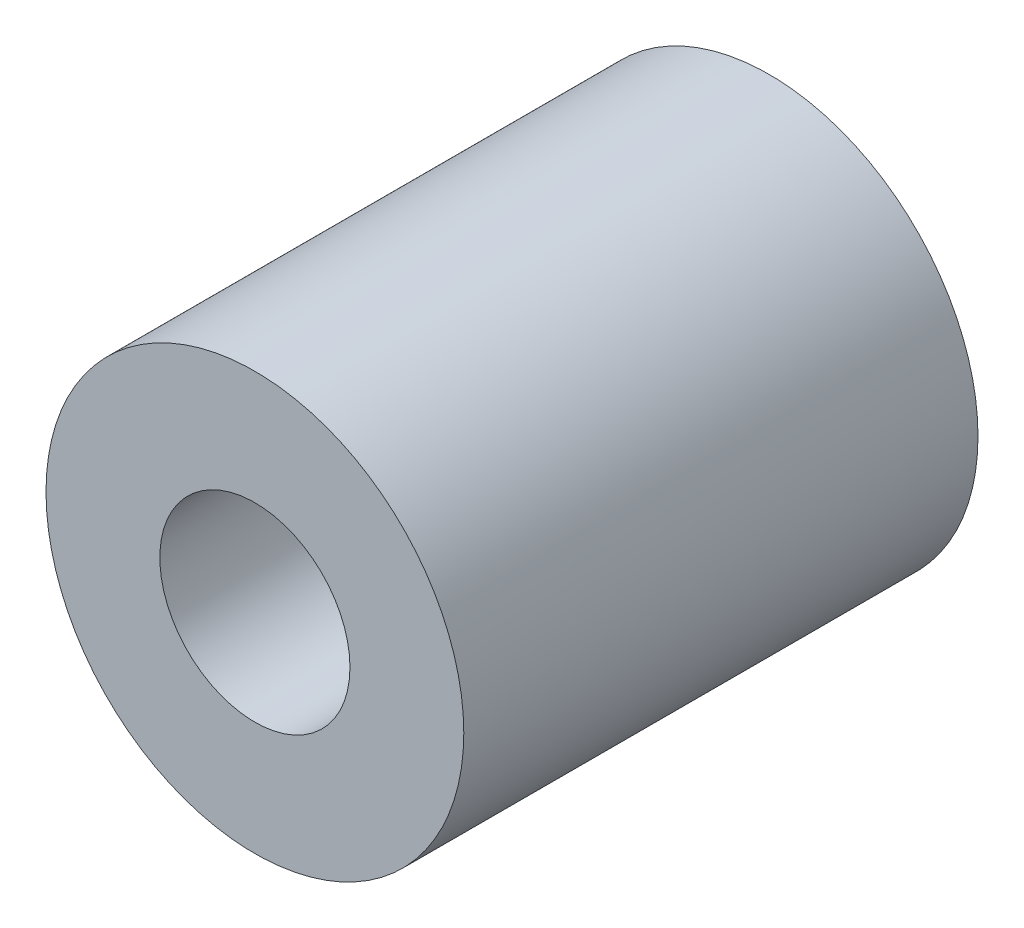
ISO-10303-21;
HEADER;
FILE_DESCRIPTION(('STEP AP214'),'2;1');
FILE_NAME('part.step','',(''),(''),'','','');
FILE_SCHEMA(('AUTOMOTIVE_DESIGN { 1 0 10303 214 1 1 1 1 }'));
ENDSEC;
DATA;
#1=APPLICATION_CONTEXT('core data for automotive mechanical design processes');
#2=APPLICATION_PROTOCOL_DEFINITION('international standard','automotive_design',2000,#1);
#3=PRODUCT_CONTEXT('',#1,'mechanical');
#4=PRODUCT('Part','Part','',(#3));
#5=PRODUCT_RELATED_PRODUCT_CATEGORY('part','',(#4));
#6=PRODUCT_DEFINITION_FORMATION('','',#4);
#7=PRODUCT_DEFINITION_CONTEXT('part definition',#1,'design');
#8=PRODUCT_DEFINITION('design','',#6,#7);
#9=PRODUCT_DEFINITION_SHAPE('','',#8);
#10=(LENGTH_UNIT() NAMED_UNIT(*) SI_UNIT(.MILLI.,.METRE.));
#11=(NAMED_UNIT(*) PLANE_ANGLE_UNIT() SI_UNIT($,.RADIAN.));
#12=(NAMED_UNIT(*) SI_UNIT($,.STERADIAN.) SOLID_ANGLE_UNIT());
#13=UNCERTAINTY_MEASURE_WITH_UNIT(LENGTH_MEASURE(1.E-05),#10,'distance_accuracy_value','');
#14=(GEOMETRIC_REPRESENTATION_CONTEXT(3) GLOBAL_UNCERTAINTY_ASSIGNED_CONTEXT((#13)) GLOBAL_UNIT_ASSIGNED_CONTEXT((#10,
#11,#12)) REPRESENTATION_CONTEXT('',''));
#15=CARTESIAN_POINT('',(0.,0.,0.));
#16=DIRECTION('',(0.,0.,1.));
#17=DIRECTION('',(1.,0.,0.));
#18=AXIS2_PLACEMENT_3D('',#15,#16,#17);
#19=CARTESIAN_POINT('',(0.,0.,9.6));
#20=DIRECTION('',(0.,0.,1.));
#21=DIRECTION('',(1.,0.,0.));
#22=AXIS2_PLACEMENT_3D('',#19,#20,#21);
#23=PLANE('',#22);
#24=CARTESIAN_POINT('',(0.,0.,9.6));
#25=DIRECTION('',(0.,0.,1.));
#26=DIRECTION('',(1.,0.,0.));
#27=AXIS2_PLACEMENT_3D('',#24,#25,#26);
#28=CIRCLE('',#27,3.9);
#29=CARTESIAN_POINT('',(3.9,0.,9.6));
#30=VERTEX_POINT('',#29);
#31=EDGE_CURVE('E10',#30,#30,#28,.T.);
#32=ORIENTED_EDGE('',*,*,#31,.T.);
#33=EDGE_LOOP('',(#32));
#34=FACE_BOUND('',#33,.T.);
#35=CARTESIAN_POINT('',(0.,0.,9.6));
#36=DIRECTION('',(0.,0.,1.));
#37=DIRECTION('',(1.,0.,0.));
#38=AXIS2_PLACEMENT_3D('',#35,#36,#37);
#39=CIRCLE('',#38,1.775);
#40=CARTESIAN_POINT('',(1.775,0.,9.6));
#41=VERTEX_POINT('',#40);
#42=EDGE_CURVE('E42',#41,#41,#39,.T.);
#43=ORIENTED_EDGE('',*,*,#42,.F.);
#44=EDGE_LOOP('',(#43));
#45=FACE_BOUND('',#44,.T.);
#46=ADVANCED_FACE('F31',(#34,#45),#23,.T.);
#47=CARTESIAN_POINT('',(0.,0.,0.));
#48=DIRECTION('',(0.,0.,1.));
#49=DIRECTION('',(1.,0.,0.));
#50=AXIS2_PLACEMENT_3D('',#47,#48,#49);
#51=PLANE('',#50);
#52=CARTESIAN_POINT('',(0.,0.,0.));
#53=DIRECTION('',(0.,0.,1.));
#54=DIRECTION('',(1.,0.,0.));
#55=AXIS2_PLACEMENT_3D('',#52,#53,#54);
#56=CIRCLE('',#55,3.9);
#57=CARTESIAN_POINT('',(3.9,0.,0.));
#58=VERTEX_POINT('',#57);
#59=EDGE_CURVE('E35',#58,#58,#56,.T.);
#60=ORIENTED_EDGE('',*,*,#59,.F.);
#61=EDGE_LOOP('',(#60));
#62=FACE_BOUND('',#61,.T.);
#63=CARTESIAN_POINT('',(0.,0.,0.));
#64=DIRECTION('',(0.,0.,1.));
#65=DIRECTION('',(1.,0.,0.));
#66=AXIS2_PLACEMENT_3D('',#63,#64,#65);
#67=CIRCLE('',#66,1.775);
#68=CARTESIAN_POINT('',(1.775,0.,0.));
#69=VERTEX_POINT('',#68);
#70=EDGE_CURVE('E44',#69,#69,#67,.T.);
#71=ORIENTED_EDGE('',*,*,#70,.T.);
#72=EDGE_LOOP('',(#71));
#73=FACE_BOUND('',#72,.T.);
#74=ADVANCED_FACE('F54',(#62,#73),#51,.F.);
#75=CARTESIAN_POINT('',(0.,0.,9.6));
#76=DIRECTION('',(0.,0.,-1.));
#77=DIRECTION('',(-1.,0.,0.));
#78=AXIS2_PLACEMENT_3D('',#75,#76,#77);
#79=CYLINDRICAL_SURFACE('',#78,3.9);
#80=ORIENTED_EDGE('',*,*,#31,.F.);
#81=EDGE_LOOP('',(#80));
#82=FACE_BOUND('',#81,.T.);
#83=ORIENTED_EDGE('',*,*,#59,.T.);
#84=EDGE_LOOP('',(#83));
#85=FACE_BOUND('',#84,.T.);
#86=ADVANCED_FACE('F33',(#82,#85),#79,.T.);
#87=CARTESIAN_POINT('',(0.,0.,9.6));
#88=DIRECTION('',(0.,0.,-1.));
#89=DIRECTION('',(-1.,0.,0.));
#90=AXIS2_PLACEMENT_3D('',#87,#88,#89);
#91=CYLINDRICAL_SURFACE('',#90,1.775);
#92=ORIENTED_EDGE('',*,*,#42,.T.);
#93=EDGE_LOOP('',(#92));
#94=FACE_BOUND('',#93,.T.);
#95=ORIENTED_EDGE('',*,*,#70,.F.);
#96=EDGE_LOOP('',(#95));
#97=FACE_BOUND('',#96,.T.);
#98=ADVANCED_FACE('F50',(#94,#97),#91,.F.);
#99=CLOSED_SHELL('',(#46,#74,#86,#98));
#100=MANIFOLD_SOLID_BREP('B2',#99);
#101=ADVANCED_BREP_SHAPE_REPRESENTATION('',(#18,#100),#14);
#102=SHAPE_DEFINITION_REPRESENTATION(#9,#101);
ENDSEC;
END-ISO-10303-21;
